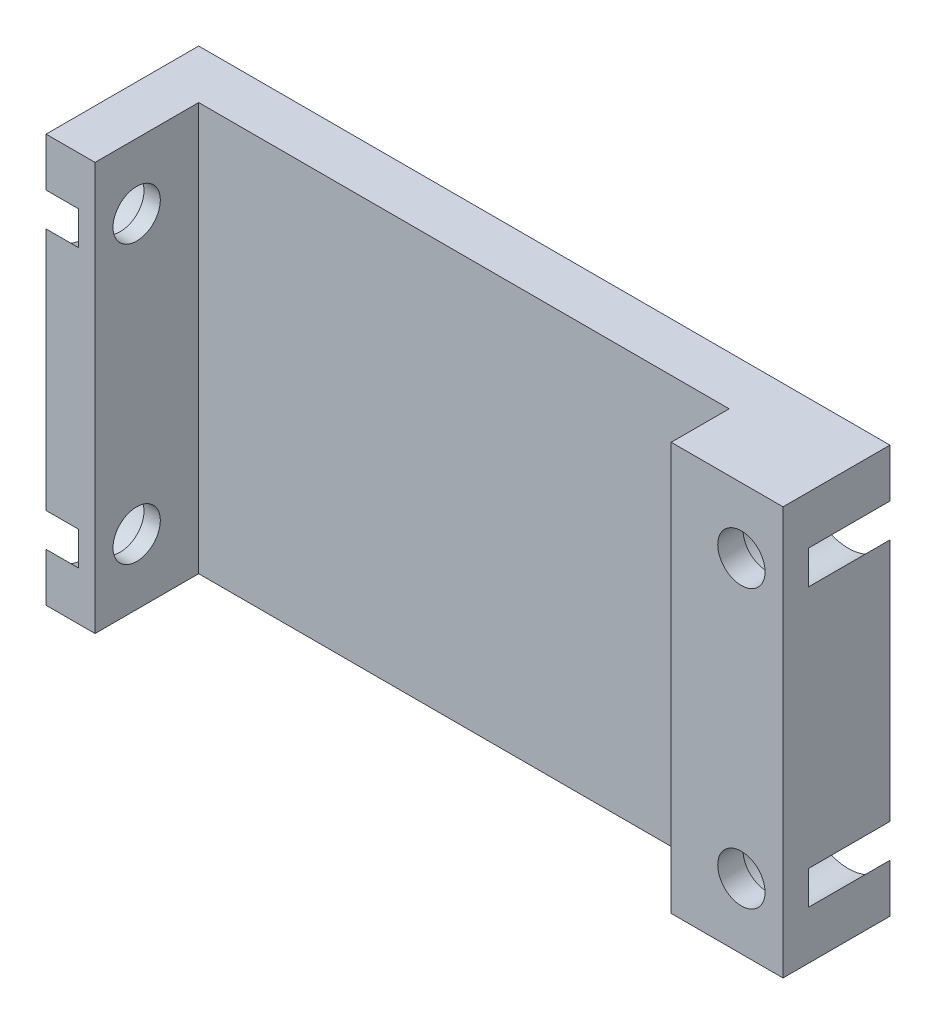
ISO-10303-21;
HEADER;
FILE_DESCRIPTION(('STEP AP214'),'2;1');
FILE_NAME('part.step','',(''),(''),'','','');
FILE_SCHEMA(('AUTOMOTIVE_DESIGN { 1 0 10303 214 1 1 1 1 }'));
ENDSEC;
DATA;
#1=APPLICATION_CONTEXT('core data for automotive mechanical design processes');
#2=APPLICATION_PROTOCOL_DEFINITION('international standard','automotive_design',2000,#1);
#3=PRODUCT_CONTEXT('',#1,'mechanical');
#4=PRODUCT('Part','Part','',(#3));
#5=PRODUCT_RELATED_PRODUCT_CATEGORY('part','',(#4));
#6=PRODUCT_DEFINITION_FORMATION('','',#4);
#7=PRODUCT_DEFINITION_CONTEXT('part definition',#1,'design');
#8=PRODUCT_DEFINITION('design','',#6,#7);
#9=PRODUCT_DEFINITION_SHAPE('','',#8);
#10=(LENGTH_UNIT() NAMED_UNIT(*) SI_UNIT(.MILLI.,.METRE.));
#11=(NAMED_UNIT(*) PLANE_ANGLE_UNIT() SI_UNIT($,.RADIAN.));
#12=(NAMED_UNIT(*) SI_UNIT($,.STERADIAN.) SOLID_ANGLE_UNIT());
#13=UNCERTAINTY_MEASURE_WITH_UNIT(LENGTH_MEASURE(1.E-05),#10,'distance_accuracy_value','');
#14=(GEOMETRIC_REPRESENTATION_CONTEXT(3) GLOBAL_UNCERTAINTY_ASSIGNED_CONTEXT((#13)) GLOBAL_UNIT_ASSIGNED_CONTEXT((#10,
#11,#12)) REPRESENTATION_CONTEXT('',''));
#15=CARTESIAN_POINT('',(0.,0.,0.));
#16=DIRECTION('',(0.,0.,1.));
#17=DIRECTION('',(1.,0.,0.));
#18=AXIS2_PLACEMENT_3D('',#15,#16,#17);
#19=CARTESIAN_POINT('',(-1.5,-22.5000000000001,-30.7214913134743));
#20=DIRECTION('',(-1.,0.,0.));
#21=DIRECTION('',(0.,0.,1.));
#22=AXIS2_PLACEMENT_3D('',#19,#20,#21);
#23=PLANE('',#22);
#24=DIRECTION('',(0.,1.,0.));
#25=VECTOR('',#24,1.);
#26=CARTESIAN_POINT('',(-1.5,-22.5000000000001,-3.79999999999977));
#27=LINE('',#26,#25);
#28=CARTESIAN_POINT('',(-1.5,-22.5000000000001,-3.79999999999977));
#29=VERTEX_POINT('',#28);
#30=CARTESIAN_POINT('',(-1.5,2.49999999999995,-3.79999999999978));
#31=VERTEX_POINT('',#30);
#32=EDGE_CURVE('E185',#29,#31,#27,.T.);
#33=ORIENTED_EDGE('',*,*,#32,.F.);
#34=DIRECTION('',(0.,0.,1.));
#35=VECTOR('',#34,1.);
#36=CARTESIAN_POINT('',(-1.5,-22.5000000000001,-30.7214913134743));
#37=LINE('',#36,#35);
#38=CARTESIAN_POINT('',(-1.5,-22.5000000000001,-0.25));
#39=VERTEX_POINT('',#38);
#40=EDGE_CURVE('E202',#29,#39,#37,.T.);
#41=ORIENTED_EDGE('',*,*,#40,.T.);
#42=DIRECTION('',(0.,-1.,0.));
#43=VECTOR('',#42,1.);
#44=CARTESIAN_POINT('',(-1.5,-22.5000000000001,-0.25));
#45=LINE('',#44,#43);
#46=CARTESIAN_POINT('',(-1.5,2.49999999999995,-0.25));
#47=VERTEX_POINT('',#46);
#48=EDGE_CURVE('E190',#47,#39,#45,.T.);
#49=ORIENTED_EDGE('',*,*,#48,.F.);
#50=DIRECTION('',(0.,0.,1.));
#51=VECTOR('',#50,1.);
#52=CARTESIAN_POINT('',(-1.5,2.49999999999995,-30.7214913134743));
#53=LINE('',#52,#51);
#54=EDGE_CURVE('E189',#31,#47,#53,.T.);
#55=ORIENTED_EDGE('',*,*,#54,.F.);
#56=EDGE_LOOP('',(#33,#41,#49,#55));
#57=FACE_BOUND('',#56,.T.);
#58=ADVANCED_FACE('F35',(#57),#23,.T.);
#59=CARTESIAN_POINT('',(-1.5,2.49999999999995,-30.7214913134743));
#60=DIRECTION('',(0.,1.,0.));
#61=DIRECTION('',(0.,0.,1.));
#62=AXIS2_PLACEMENT_3D('',#59,#60,#61);
#63=PLANE('',#62);
#64=DIRECTION('',(0.,0.,1.));
#65=VECTOR('',#64,1.);
#66=CARTESIAN_POINT('',(5.35008846034397,2.49999999999995,-30.7214913134743));
#67=LINE('',#66,#65);
#68=CARTESIAN_POINT('',(5.35008846034396,2.49999999999995,-6.79999999999978));
#69=VERTEX_POINT('',#68);
#70=CARTESIAN_POINT('',(5.35008846034397,2.49999999999995,-0.25));
#71=VERTEX_POINT('',#70);
#72=EDGE_CURVE('E204',#69,#71,#67,.T.);
#73=ORIENTED_EDGE('',*,*,#72,.F.);
#74=DIRECTION('',(1.,0.,0.));
#75=VECTOR('',#74,1.);
#76=CARTESIAN_POINT('',(5.35008846034396,2.49999999999995,-6.79999999999978));
#77=LINE('',#76,#75);
#78=CARTESIAN_POINT('',(-37.,2.49999999999995,-6.79999999999978));
#79=VERTEX_POINT('',#78);
#80=EDGE_CURVE('E165',#79,#69,#77,.T.);
#81=ORIENTED_EDGE('',*,*,#80,.F.);
#82=DIRECTION('',(0.,0.,-1.));
#83=VECTOR('',#82,1.);
#84=CARTESIAN_POINT('',(-37.,2.49999999999995,-6.79999999999978));
#85=LINE('',#84,#83);
#86=CARTESIAN_POINT('',(-37.,2.49999999999995,2.55));
#87=VERTEX_POINT('',#86);
#88=EDGE_CURVE('E277',#87,#79,#85,.T.);
#89=ORIENTED_EDGE('',*,*,#88,.F.);
#90=DIRECTION('',(1.,0.,0.));
#91=VECTOR('',#90,1.);
#92=CARTESIAN_POINT('',(-37.,2.49999999999995,2.55));
#93=LINE('',#92,#91);
#94=CARTESIAN_POINT('',(-34.,2.49999999999995,2.55));
#95=VERTEX_POINT('',#94);
#96=EDGE_CURVE('E281',#87,#95,#93,.T.);
#97=ORIENTED_EDGE('',*,*,#96,.T.);
#98=DIRECTION('',(0.,0.,-1.));
#99=VECTOR('',#98,1.);
#100=CARTESIAN_POINT('',(-34.,2.49999999999995,-6.79999999999978));
#101=LINE('',#100,#99);
#102=CARTESIAN_POINT('',(-34.,2.49999999999995,-3.79999999999978));
#103=VERTEX_POINT('',#102);
#104=EDGE_CURVE('E271',#95,#103,#101,.T.);
#105=ORIENTED_EDGE('',*,*,#104,.T.);
#106=DIRECTION('',(1.,0.,0.));
#107=VECTOR('',#106,1.);
#108=CARTESIAN_POINT('',(5.35008846034396,2.49999999999995,-3.79999999999978));
#109=LINE('',#108,#107);
#110=EDGE_CURVE('E172',#103,#31,#109,.T.);
#111=ORIENTED_EDGE('',*,*,#110,.T.);
#112=ORIENTED_EDGE('',*,*,#54,.T.);
#113=DIRECTION('',(-1.,0.,0.));
#114=VECTOR('',#113,1.);
#115=CARTESIAN_POINT('',(-1.5,2.49999999999995,-0.25));
#116=LINE('',#115,#114);
#117=EDGE_CURVE('E199',#71,#47,#116,.T.);
#118=ORIENTED_EDGE('',*,*,#117,.F.);
#119=EDGE_LOOP('',(#73,#81,#89,#97,#105,#111,#112,#118));
#120=FACE_BOUND('',#119,.T.);
#121=ADVANCED_FACE('F310',(#120),#63,.T.);
#122=CARTESIAN_POINT('',(5.35008846034397,-22.5000000000001,-30.7214913134743));
#123=DIRECTION('',(1.,0.,0.));
#124=DIRECTION('',(0.,0.,-1.));
#125=AXIS2_PLACEMENT_3D('',#122,#123,#124);
#126=PLANE('',#125);
#127=DIRECTION('',(0.,0.,-1.));
#128=VECTOR('',#127,1.);
#129=CARTESIAN_POINT('',(5.35008846034396,-2.52934389026236,-6.79999999999978));
#130=LINE('',#129,#128);
#131=CARTESIAN_POINT('',(5.35008846034397,-2.52934389026236,-1.79999999999977));
#132=VERTEX_POINT('',#131);
#133=CARTESIAN_POINT('',(5.35008846034396,-2.52934389026236,-6.79999999999978));
#134=VERTEX_POINT('',#133);
#135=EDGE_CURVE('E49',#132,#134,#130,.T.);
#136=ORIENTED_EDGE('',*,*,#135,.F.);
#137=DIRECTION('',(0.,-1.,0.));
#138=VECTOR('',#137,1.);
#139=CARTESIAN_POINT('',(5.35008846034397,-22.5000000000001,-1.79999999999977));
#140=LINE('',#139,#138);
#141=CARTESIAN_POINT('',(5.35008846034397,-0.470656109737746,-1.79999999999977));
#142=VERTEX_POINT('',#141);
#143=EDGE_CURVE('E11',#142,#132,#140,.T.);
#144=ORIENTED_EDGE('',*,*,#143,.F.);
#145=DIRECTION('',(0.,0.,-1.));
#146=VECTOR('',#145,1.);
#147=CARTESIAN_POINT('',(5.35008846034396,-0.470656109737747,-6.79999999999978));
#148=LINE('',#147,#146);
#149=CARTESIAN_POINT('',(5.35008846034396,-0.470656109737745,-6.79999999999978));
#150=VERTEX_POINT('',#149);
#151=EDGE_CURVE('E148',#150,#142,#148,.F.);
#152=ORIENTED_EDGE('',*,*,#151,.F.);
#153=DIRECTION('',(0.,-1.,0.));
#154=VECTOR('',#153,1.);
#155=CARTESIAN_POINT('',(5.35008846034396,2.49999999999995,-6.79999999999978));
#156=LINE('',#155,#154);
#157=EDGE_CURVE('E159',#69,#150,#156,.T.);
#158=ORIENTED_EDGE('',*,*,#157,.F.);
#159=ORIENTED_EDGE('',*,*,#72,.T.);
#160=DIRECTION('',(0.,1.,0.));
#161=VECTOR('',#160,1.);
#162=CARTESIAN_POINT('',(5.35008846034397,-22.5000000000001,-0.25));
#163=LINE('',#162,#161);
#164=CARTESIAN_POINT('',(5.35008846034397,-22.5000000000001,-0.25));
#165=VERTEX_POINT('',#164);
#166=EDGE_CURVE('E196',#165,#71,#163,.T.);
#167=ORIENTED_EDGE('',*,*,#166,.F.);
#168=DIRECTION('',(0.,0.,1.));
#169=VECTOR('',#168,1.);
#170=CARTESIAN_POINT('',(5.35008846034397,-22.5000000000001,-30.7214913134743));
#171=LINE('',#170,#169);
#172=CARTESIAN_POINT('',(5.35008846034396,-22.5000000000001,-6.79999999999978));
#173=VERTEX_POINT('',#172);
#174=EDGE_CURVE('E206',#173,#165,#171,.T.);
#175=ORIENTED_EDGE('',*,*,#174,.F.);
#176=CARTESIAN_POINT('',(5.35008846034396,-19.5293438902624,-6.79999999999978));
#177=VERTEX_POINT('',#176);
#178=EDGE_CURVE('E169',#177,#173,#156,.T.);
#179=ORIENTED_EDGE('',*,*,#178,.F.);
#180=DIRECTION('',(0.,0.,-1.));
#181=VECTOR('',#180,1.);
#182=CARTESIAN_POINT('',(5.35008846034396,-19.5293438902624,-6.79999999999978));
#183=LINE('',#182,#181);
#184=CARTESIAN_POINT('',(5.35008846034397,-19.5293438902624,-1.79999999999977));
#185=VERTEX_POINT('',#184);
#186=EDGE_CURVE('E57',#185,#177,#183,.T.);
#187=ORIENTED_EDGE('',*,*,#186,.F.);
#188=DIRECTION('',(0.,-1.,0.));
#189=VECTOR('',#188,1.);
#190=CARTESIAN_POINT('',(5.35008846034397,-22.5000000000001,-1.79999999999977));
#191=LINE('',#190,#189);
#192=CARTESIAN_POINT('',(5.35008846034397,-17.4706561097377,-1.79999999999977));
#193=VERTEX_POINT('',#192);
#194=EDGE_CURVE('E153',#193,#185,#191,.T.);
#195=ORIENTED_EDGE('',*,*,#194,.F.);
#196=DIRECTION('',(0.,0.,-1.));
#197=VECTOR('',#196,1.);
#198=CARTESIAN_POINT('',(5.35008846034396,-17.4706561097377,-6.79999999999978));
#199=LINE('',#198,#197);
#200=CARTESIAN_POINT('',(5.35008846034396,-17.4706561097377,-6.79999999999978));
#201=VERTEX_POINT('',#200);
#202=EDGE_CURVE('E235',#201,#193,#199,.F.);
#203=ORIENTED_EDGE('',*,*,#202,.F.);
#204=EDGE_CURVE('E167',#134,#201,#156,.T.);
#205=ORIENTED_EDGE('',*,*,#204,.F.);
#206=EDGE_LOOP('',(#136,#144,#152,#158,#159,#167,#175,#179,#187,#195,#203,#205));
#207=FACE_BOUND('',#206,.T.);
#208=ADVANCED_FACE('F158',(#207),#126,.T.);
#209=CARTESIAN_POINT('',(-1.5,-22.5000000000001,-30.7214913134743));
#210=DIRECTION('',(0.,-1.,0.));
#211=DIRECTION('',(0.,0.,-1.));
#212=AXIS2_PLACEMENT_3D('',#209,#210,#211);
#213=PLANE('',#212);
#214=ORIENTED_EDGE('',*,*,#40,.F.);
#215=DIRECTION('',(-1.,0.,0.));
#216=VECTOR('',#215,1.);
#217=CARTESIAN_POINT('',(5.35008846034396,-22.5000000000001,-3.79999999999978));
#218=LINE('',#217,#216);
#219=CARTESIAN_POINT('',(-34.,-22.5000000000001,-3.79999999999978));
#220=VERTEX_POINT('',#219);
#221=EDGE_CURVE('E181',#29,#220,#218,.T.);
#222=ORIENTED_EDGE('',*,*,#221,.T.);
#223=DIRECTION('',(0.,0.,1.));
#224=VECTOR('',#223,1.);
#225=CARTESIAN_POINT('',(-34.,-22.5000000000001,-6.79999999999978));
#226=LINE('',#225,#224);
#227=CARTESIAN_POINT('',(-34.,-22.5000000000001,2.55));
#228=VERTEX_POINT('',#227);
#229=EDGE_CURVE('E263',#220,#228,#226,.T.);
#230=ORIENTED_EDGE('',*,*,#229,.T.);
#231=DIRECTION('',(1.,0.,0.));
#232=VECTOR('',#231,1.);
#233=CARTESIAN_POINT('',(-37.,-22.5000000000001,2.55));
#234=LINE('',#233,#232);
#235=CARTESIAN_POINT('',(-37.,-22.5000000000001,2.55));
#236=VERTEX_POINT('',#235);
#237=EDGE_CURVE('E287',#236,#228,#234,.T.);
#238=ORIENTED_EDGE('',*,*,#237,.F.);
#239=DIRECTION('',(0.,0.,1.));
#240=VECTOR('',#239,1.);
#241=CARTESIAN_POINT('',(-37.,-22.5000000000001,-6.79999999999978));
#242=LINE('',#241,#240);
#243=CARTESIAN_POINT('',(-37.,-22.5000000000001,-6.79999999999978));
#244=VERTEX_POINT('',#243);
#245=EDGE_CURVE('E270',#244,#236,#242,.T.);
#246=ORIENTED_EDGE('',*,*,#245,.F.);
#247=DIRECTION('',(-1.,0.,0.));
#248=VECTOR('',#247,1.);
#249=CARTESIAN_POINT('',(5.35008846034396,-22.5000000000001,-6.79999999999978));
#250=LINE('',#249,#248);
#251=EDGE_CURVE('E166',#173,#244,#250,.T.);
#252=ORIENTED_EDGE('',*,*,#251,.F.);
#253=ORIENTED_EDGE('',*,*,#174,.T.);
#254=DIRECTION('',(1.,0.,0.));
#255=VECTOR('',#254,1.);
#256=CARTESIAN_POINT('',(-1.5,-22.5000000000001,-0.25));
#257=LINE('',#256,#255);
#258=EDGE_CURVE('E193',#39,#165,#257,.T.);
#259=ORIENTED_EDGE('',*,*,#258,.F.);
#260=EDGE_LOOP('',(#214,#222,#230,#238,#246,#252,#253,#259));
#261=FACE_BOUND('',#260,.T.);
#262=ADVANCED_FACE('F298',(#261),#213,.T.);
#263=CARTESIAN_POINT('',(0.,0.,-0.25));
#264=DIRECTION('',(0.,0.,-1.));
#265=DIRECTION('',(-1.,0.,0.));
#266=AXIS2_PLACEMENT_3D('',#263,#264,#265);
#267=PLANE('',#266);
#268=CARTESIAN_POINT('',(2.79999999999996,-1.50000000000005,-0.25));
#269=DIRECTION('',(0.,0.,-1.));
#270=DIRECTION('',(-1.,0.,0.));
#271=AXIS2_PLACEMENT_3D('',#268,#269,#270);
#272=CIRCLE('',#271,1.45);
#273=CARTESIAN_POINT('',(1.34999999999996,-1.50000000000005,-0.25));
#274=VERTEX_POINT('',#273);
#275=EDGE_CURVE('E160',#274,#274,#272,.T.);
#276=ORIENTED_EDGE('',*,*,#275,.T.);
#277=EDGE_LOOP('',(#276));
#278=FACE_BOUND('',#277,.T.);
#279=CARTESIAN_POINT('',(2.79999999999996,-18.5000000000001,-0.25));
#280=DIRECTION('',(0.,0.,-1.));
#281=DIRECTION('',(-1.,0.,0.));
#282=AXIS2_PLACEMENT_3D('',#279,#280,#281);
#283=CIRCLE('',#282,1.45);
#284=CARTESIAN_POINT('',(1.34999999999996,-18.5000000000001,-0.25));
#285=VERTEX_POINT('',#284);
#286=EDGE_CURVE('E232',#285,#285,#283,.T.);
#287=ORIENTED_EDGE('',*,*,#286,.T.);
#288=EDGE_LOOP('',(#287));
#289=FACE_BOUND('',#288,.T.);
#290=ORIENTED_EDGE('',*,*,#48,.T.);
#291=ORIENTED_EDGE('',*,*,#258,.T.);
#292=ORIENTED_EDGE('',*,*,#166,.T.);
#293=ORIENTED_EDGE('',*,*,#117,.T.);
#294=EDGE_LOOP('',(#290,#291,#292,#293));
#295=FACE_BOUND('',#294,.T.);
#296=ADVANCED_FACE('F352',(#278,#289,#295),#267,.F.);
#297=CARTESIAN_POINT('',(0.,0.,-3.79999999999978));
#298=DIRECTION('',(0.,0.,-1.));
#299=DIRECTION('',(-1.,0.,0.));
#300=AXIS2_PLACEMENT_3D('',#297,#298,#299);
#301=PLANE('',#300);
#302=ORIENTED_EDGE('',*,*,#221,.F.);
#303=ORIENTED_EDGE('',*,*,#32,.T.);
#304=ORIENTED_EDGE('',*,*,#110,.F.);
#305=DIRECTION('',(0.,1.,0.));
#306=VECTOR('',#305,1.);
#307=CARTESIAN_POINT('',(-34.,2.49999999999995,-3.79999999999978));
#308=LINE('',#307,#306);
#309=EDGE_CURVE('E176',#220,#103,#308,.T.);
#310=ORIENTED_EDGE('',*,*,#309,.F.);
#311=EDGE_LOOP('',(#302,#303,#304,#310));
#312=FACE_BOUND('',#311,.T.);
#313=ADVANCED_FACE('F302',(#312),#301,.F.);
#314=CARTESIAN_POINT('',(0.,0.,-6.79999999999978));
#315=DIRECTION('',(0.,0.,-1.));
#316=DIRECTION('',(-1.,0.,0.));
#317=AXIS2_PLACEMENT_3D('',#314,#315,#316);
#318=PLANE('',#317);
#319=CARTESIAN_POINT('',(2.79999999999996,-1.50000000000005,-6.79999999999978));
#320=DIRECTION('',(0.,0.,-1.));
#321=DIRECTION('',(-1.,0.,0.));
#322=AXIS2_PLACEMENT_3D('',#319,#320,#321);
#323=CIRCLE('',#322,2.75);
#324=EDGE_CURVE('E42',#134,#150,#323,.T.);
#325=ORIENTED_EDGE('',*,*,#324,.F.);
#326=ORIENTED_EDGE('',*,*,#204,.T.);
#327=CARTESIAN_POINT('',(2.79999999999996,-18.5000000000001,-6.79999999999978));
#328=DIRECTION('',(0.,0.,-1.));
#329=DIRECTION('',(-1.,0.,0.));
#330=AXIS2_PLACEMENT_3D('',#327,#328,#329);
#331=CIRCLE('',#330,2.75);
#332=EDGE_CURVE('E219',#177,#201,#331,.T.);
#333=ORIENTED_EDGE('',*,*,#332,.F.);
#334=ORIENTED_EDGE('',*,*,#178,.T.);
#335=ORIENTED_EDGE('',*,*,#251,.T.);
#336=DIRECTION('',(0.,-1.,0.));
#337=VECTOR('',#336,1.);
#338=CARTESIAN_POINT('',(-37.,-22.5000000000001,-6.79999999999978));
#339=LINE('',#338,#337);
#340=EDGE_CURVE('E267',#79,#244,#339,.T.);
#341=ORIENTED_EDGE('',*,*,#340,.F.);
#342=ORIENTED_EDGE('',*,*,#80,.T.);
#343=ORIENTED_EDGE('',*,*,#157,.T.);
#344=EDGE_LOOP('',(#325,#326,#333,#334,#335,#341,#342,#343));
#345=FACE_BOUND('',#344,.T.);
#346=ADVANCED_FACE('F163',(#345),#318,.T.);
#347=CARTESIAN_POINT('',(-37.,-22.5000000000001,2.55));
#348=DIRECTION('',(0.,0.,-1.));
#349=DIRECTION('',(-1.,0.,0.));
#350=AXIS2_PLACEMENT_3D('',#347,#348,#349);
#351=PLANE('',#350);
#352=DIRECTION('',(0.,-1.,0.));
#353=VECTOR('',#352,1.);
#354=CARTESIAN_POINT('',(-35.,-22.5000000000001,2.55));
#355=LINE('',#354,#353);
#356=CARTESIAN_POINT('',(-35.,-0.470436985901365,2.55));
#357=VERTEX_POINT('',#356);
#358=CARTESIAN_POINT('',(-35.,-2.52956301409878,2.55));
#359=VERTEX_POINT('',#358);
#360=EDGE_CURVE('E217',#357,#359,#355,.T.);
#361=ORIENTED_EDGE('',*,*,#360,.T.);
#362=DIRECTION('',(-1.,0.,0.));
#363=VECTOR('',#362,1.);
#364=CARTESIAN_POINT('',(-37.0000000000001,-2.52956301409878,2.55));
#365=LINE('',#364,#363);
#366=CARTESIAN_POINT('',(-37.0000000000001,-2.52956301409878,2.55));
#367=VERTEX_POINT('',#366);
#368=EDGE_CURVE('E252',#359,#367,#365,.T.);
#369=ORIENTED_EDGE('',*,*,#368,.T.);
#370=DIRECTION('',(0.,1.,0.));
#371=VECTOR('',#370,1.);
#372=CARTESIAN_POINT('',(-37.,-22.5000000000001,2.55));
#373=LINE('',#372,#371);
#374=CARTESIAN_POINT('',(-37.,-17.4704369859014,2.55));
#375=VERTEX_POINT('',#374);
#376=EDGE_CURVE('E278',#375,#367,#373,.T.);
#377=ORIENTED_EDGE('',*,*,#376,.F.);
#378=DIRECTION('',(-1.,0.,0.));
#379=VECTOR('',#378,1.);
#380=CARTESIAN_POINT('',(-37.,-17.4704369859014,2.55));
#381=LINE('',#380,#379);
#382=CARTESIAN_POINT('',(-35.,-17.4704369859014,2.55));
#383=VERTEX_POINT('',#382);
#384=EDGE_CURVE('E188',#375,#383,#381,.F.);
#385=ORIENTED_EDGE('',*,*,#384,.T.);
#386=DIRECTION('',(0.,-1.,0.));
#387=VECTOR('',#386,1.);
#388=CARTESIAN_POINT('',(-35.,-22.5000000000001,2.55));
#389=LINE('',#388,#387);
#390=CARTESIAN_POINT('',(-35.,-19.5295630140988,2.55));
#391=VERTEX_POINT('',#390);
#392=EDGE_CURVE('E211',#383,#391,#389,.T.);
#393=ORIENTED_EDGE('',*,*,#392,.T.);
#394=DIRECTION('',(-1.,0.,0.));
#395=VECTOR('',#394,1.);
#396=CARTESIAN_POINT('',(-37.,-19.5295630140988,2.55));
#397=LINE('',#396,#395);
#398=CARTESIAN_POINT('',(-37.,-19.5295630140988,2.55));
#399=VERTEX_POINT('',#398);
#400=EDGE_CURVE('E214',#391,#399,#397,.T.);
#401=ORIENTED_EDGE('',*,*,#400,.T.);
#402=EDGE_CURVE('E274',#236,#399,#373,.T.);
#403=ORIENTED_EDGE('',*,*,#402,.F.);
#404=ORIENTED_EDGE('',*,*,#237,.T.);
#405=DIRECTION('',(0.,1.,0.));
#406=VECTOR('',#405,1.);
#407=CARTESIAN_POINT('',(-34.,-22.5000000000001,2.55));
#408=LINE('',#407,#406);
#409=EDGE_CURVE('E283',#228,#95,#408,.T.);
#410=ORIENTED_EDGE('',*,*,#409,.T.);
#411=ORIENTED_EDGE('',*,*,#96,.F.);
#412=CARTESIAN_POINT('',(-37.,-0.470436985901365,2.55));
#413=VERTEX_POINT('',#412);
#414=EDGE_CURVE('E273',#413,#87,#373,.T.);
#415=ORIENTED_EDGE('',*,*,#414,.F.);
#416=DIRECTION('',(-1.,0.,0.));
#417=VECTOR('',#416,1.);
#418=CARTESIAN_POINT('',(-37.0000000000001,-0.470436985901365,2.55));
#419=LINE('',#418,#417);
#420=EDGE_CURVE('E246',#413,#357,#419,.F.);
#421=ORIENTED_EDGE('',*,*,#420,.T.);
#422=EDGE_LOOP('',(#361,#369,#377,#385,#393,#401,#403,#404,#410,#411,#415,#421));
#423=FACE_BOUND('',#422,.T.);
#424=ADVANCED_FACE('F307',(#423),#351,.F.);
#425=CARTESIAN_POINT('',(-37.,0.,0.));
#426=DIRECTION('',(1.,0.,0.));
#427=DIRECTION('',(0.,0.,-1.));
#428=AXIS2_PLACEMENT_3D('',#425,#426,#427);
#429=PLANE('',#428);
#430=ORIENTED_EDGE('',*,*,#376,.T.);
#431=CARTESIAN_POINT('',(-37.0000000000001,-1.50000000000007,0.));
#432=DIRECTION('',(-1.,0.,0.));
#433=DIRECTION('',(0.,0.,1.));
#434=AXIS2_PLACEMENT_3D('',#431,#432,#433);
#435=CIRCLE('',#434,2.75);
#436=EDGE_CURVE('E238',#413,#367,#435,.T.);
#437=ORIENTED_EDGE('',*,*,#436,.F.);
#438=ORIENTED_EDGE('',*,*,#414,.T.);
#439=ORIENTED_EDGE('',*,*,#88,.T.);
#440=ORIENTED_EDGE('',*,*,#340,.T.);
#441=ORIENTED_EDGE('',*,*,#245,.T.);
#442=ORIENTED_EDGE('',*,*,#402,.T.);
#443=CARTESIAN_POINT('',(-37.,-18.5000000000001,0.));
#444=DIRECTION('',(-1.,0.,0.));
#445=DIRECTION('',(0.,0.,1.));
#446=AXIS2_PLACEMENT_3D('',#443,#444,#445);
#447=CIRCLE('',#446,2.75);
#448=EDGE_CURVE('E255',#375,#399,#447,.T.);
#449=ORIENTED_EDGE('',*,*,#448,.F.);
#450=EDGE_LOOP('',(#430,#437,#438,#439,#440,#441,#442,#449));
#451=FACE_BOUND('',#450,.T.);
#452=ADVANCED_FACE('F313',(#451),#429,.F.);
#453=CARTESIAN_POINT('',(-34.,0.,0.));
#454=DIRECTION('',(1.,0.,0.));
#455=DIRECTION('',(0.,0.,-1.));
#456=AXIS2_PLACEMENT_3D('',#453,#454,#455);
#457=PLANE('',#456);
#458=CARTESIAN_POINT('',(-34.,-1.50000000000007,0.));
#459=DIRECTION('',(1.,0.,0.));
#460=DIRECTION('',(0.,0.,-1.));
#461=AXIS2_PLACEMENT_3D('',#458,#459,#460);
#462=CIRCLE('',#461,1.45);
#463=CARTESIAN_POINT('',(-34.,-1.50000000000007,-1.45));
#464=VERTEX_POINT('',#463);
#465=EDGE_CURVE('E243',#464,#464,#462,.F.);
#466=ORIENTED_EDGE('',*,*,#465,.T.);
#467=EDGE_LOOP('',(#466));
#468=FACE_BOUND('',#467,.T.);
#469=CARTESIAN_POINT('',(-34.,-18.5000000000001,0.));
#470=DIRECTION('',(1.,0.,0.));
#471=DIRECTION('',(0.,0.,-1.));
#472=AXIS2_PLACEMENT_3D('',#469,#470,#471);
#473=CIRCLE('',#472,1.45);
#474=CARTESIAN_POINT('',(-34.,-18.5000000000001,-1.45));
#475=VERTEX_POINT('',#474);
#476=EDGE_CURVE('E260',#475,#475,#473,.F.);
#477=ORIENTED_EDGE('',*,*,#476,.T.);
#478=EDGE_LOOP('',(#477));
#479=FACE_BOUND('',#478,.T.);
#480=ORIENTED_EDGE('',*,*,#229,.F.);
#481=ORIENTED_EDGE('',*,*,#309,.T.);
#482=ORIENTED_EDGE('',*,*,#104,.F.);
#483=ORIENTED_EDGE('',*,*,#409,.F.);
#484=EDGE_LOOP('',(#480,#481,#482,#483));
#485=FACE_BOUND('',#484,.T.);
#486=ADVANCED_FACE('F305',(#468,#479,#485),#457,.T.);
#487=CARTESIAN_POINT('',(-35.,-17.0500000000001,0.));
#488=DIRECTION('',(1.,0.,0.));
#489=DIRECTION('',(0.,0.,-1.));
#490=AXIS2_PLACEMENT_3D('',#487,#488,#489);
#491=PLANE('',#490);
#492=CARTESIAN_POINT('',(-35.,-18.5000000000001,0.));
#493=DIRECTION('',(-1.,0.,0.));
#494=DIRECTION('',(0.,0.,1.));
#495=AXIS2_PLACEMENT_3D('',#492,#493,#494);
#496=CIRCLE('',#495,1.45);
#497=CARTESIAN_POINT('',(-35.,-18.5000000000001,1.45));
#498=VERTEX_POINT('',#497);
#499=EDGE_CURVE('E256',#498,#498,#496,.T.);
#500=ORIENTED_EDGE('',*,*,#499,.F.);
#501=EDGE_LOOP('',(#500));
#502=FACE_BOUND('',#501,.T.);
#503=CARTESIAN_POINT('',(-35.,-18.5000000000001,0.));
#504=DIRECTION('',(-1.,0.,0.));
#505=DIRECTION('',(0.,0.,1.));
#506=AXIS2_PLACEMENT_3D('',#503,#504,#505);
#507=CIRCLE('',#506,2.75);
#508=EDGE_CURVE('E259',#383,#391,#507,.T.);
#509=ORIENTED_EDGE('',*,*,#508,.T.);
#510=ORIENTED_EDGE('',*,*,#392,.F.);
#511=EDGE_LOOP('',(#509,#510));
#512=FACE_BOUND('',#511,.T.);
#513=ADVANCED_FACE('F323',(#502,#512),#491,.F.);
#514=CARTESIAN_POINT('',(-37.,-18.5000000000001,0.));
#515=DIRECTION('',(-1.,0.,0.));
#516=DIRECTION('',(0.,0.,1.));
#517=AXIS2_PLACEMENT_3D('',#514,#515,#516);
#518=CYLINDRICAL_SURFACE('',#517,2.75);
#519=ORIENTED_EDGE('',*,*,#508,.F.);
#520=ORIENTED_EDGE('',*,*,#384,.F.);
#521=ORIENTED_EDGE('',*,*,#448,.T.);
#522=ORIENTED_EDGE('',*,*,#400,.F.);
#523=EDGE_LOOP('',(#519,#520,#521,#522));
#524=FACE_BOUND('',#523,.T.);
#525=ADVANCED_FACE('F321',(#524),#518,.F.);
#526=CARTESIAN_POINT('',(-37.,-18.5000000000001,0.));
#527=DIRECTION('',(-1.,0.,0.));
#528=DIRECTION('',(0.,0.,1.));
#529=AXIS2_PLACEMENT_3D('',#526,#527,#528);
#530=CYLINDRICAL_SURFACE('',#529,1.45);
#531=ORIENTED_EDGE('',*,*,#476,.F.);
#532=EDGE_LOOP('',(#531));
#533=FACE_BOUND('',#532,.T.);
#534=ORIENTED_EDGE('',*,*,#499,.T.);
#535=EDGE_LOOP('',(#534));
#536=FACE_BOUND('',#535,.T.);
#537=ADVANCED_FACE('F330',(#533,#536),#530,.F.);
#538=CARTESIAN_POINT('',(-35.,-0.0500000000000715,0.));
#539=DIRECTION('',(1.,0.,0.));
#540=DIRECTION('',(0.,0.,-1.));
#541=AXIS2_PLACEMENT_3D('',#538,#539,#540);
#542=PLANE('',#541);
#543=CARTESIAN_POINT('',(-35.,-1.50000000000007,0.));
#544=DIRECTION('',(-1.,0.,0.));
#545=DIRECTION('',(0.,0.,1.));
#546=AXIS2_PLACEMENT_3D('',#543,#544,#545);
#547=CIRCLE('',#546,1.45);
#548=CARTESIAN_POINT('',(-35.,-1.50000000000007,1.45));
#549=VERTEX_POINT('',#548);
#550=EDGE_CURVE('E239',#549,#549,#547,.T.);
#551=ORIENTED_EDGE('',*,*,#550,.F.);
#552=EDGE_LOOP('',(#551));
#553=FACE_BOUND('',#552,.T.);
#554=CARTESIAN_POINT('',(-35.,-1.50000000000007,0.));
#555=DIRECTION('',(-1.,0.,0.));
#556=DIRECTION('',(0.,0.,1.));
#557=AXIS2_PLACEMENT_3D('',#554,#555,#556);
#558=CIRCLE('',#557,2.75);
#559=EDGE_CURVE('E242',#357,#359,#558,.T.);
#560=ORIENTED_EDGE('',*,*,#559,.T.);
#561=ORIENTED_EDGE('',*,*,#360,.F.);
#562=EDGE_LOOP('',(#560,#561));
#563=FACE_BOUND('',#562,.T.);
#564=ADVANCED_FACE('F328',(#553,#563),#542,.F.);
#565=CARTESIAN_POINT('',(-37.0000000000001,-1.50000000000007,0.));
#566=DIRECTION('',(-1.,0.,0.));
#567=DIRECTION('',(0.,0.,1.));
#568=AXIS2_PLACEMENT_3D('',#565,#566,#567);
#569=CYLINDRICAL_SURFACE('',#568,2.75);
#570=ORIENTED_EDGE('',*,*,#559,.F.);
#571=ORIENTED_EDGE('',*,*,#420,.F.);
#572=ORIENTED_EDGE('',*,*,#436,.T.);
#573=ORIENTED_EDGE('',*,*,#368,.F.);
#574=EDGE_LOOP('',(#570,#571,#572,#573));
#575=FACE_BOUND('',#574,.T.);
#576=ADVANCED_FACE('F326',(#575),#569,.F.);
#577=CARTESIAN_POINT('',(-37.0000000000001,-1.50000000000007,0.));
#578=DIRECTION('',(-1.,0.,0.));
#579=DIRECTION('',(0.,0.,1.));
#580=AXIS2_PLACEMENT_3D('',#577,#578,#579);
#581=CYLINDRICAL_SURFACE('',#580,1.45);
#582=ORIENTED_EDGE('',*,*,#465,.F.);
#583=EDGE_LOOP('',(#582));
#584=FACE_BOUND('',#583,.T.);
#585=ORIENTED_EDGE('',*,*,#550,.T.);
#586=EDGE_LOOP('',(#585));
#587=FACE_BOUND('',#586,.T.);
#588=ADVANCED_FACE('F337',(#584,#587),#581,.F.);
#589=CARTESIAN_POINT('',(2.79999999999996,-18.5000000000001,-6.79999999999978));
#590=DIRECTION('',(0.,0.,-1.));
#591=DIRECTION('',(-1.,0.,0.));
#592=AXIS2_PLACEMENT_3D('',#589,#590,#591);
#593=CYLINDRICAL_SURFACE('',#592,1.45);
#594=ORIENTED_EDGE('',*,*,#286,.F.);
#595=EDGE_LOOP('',(#594));
#596=FACE_BOUND('',#595,.T.);
#597=CARTESIAN_POINT('',(2.79999999999996,-18.5000000000001,-1.79999999999977));
#598=DIRECTION('',(0.,0.,-1.));
#599=DIRECTION('',(-1.,0.,0.));
#600=AXIS2_PLACEMENT_3D('',#597,#598,#599);
#601=CIRCLE('',#600,1.45);
#602=CARTESIAN_POINT('',(1.34999999999996,-18.5000000000001,-1.79999999999977));
#603=VERTEX_POINT('',#602);
#604=EDGE_CURVE('E229',#603,#603,#601,.T.);
#605=ORIENTED_EDGE('',*,*,#604,.T.);
#606=EDGE_LOOP('',(#605));
#607=FACE_BOUND('',#606,.T.);
#608=ADVANCED_FACE('F358',(#596,#607),#593,.F.);
#609=CARTESIAN_POINT('',(4.24999999999996,-18.5000000000001,-1.79999999999977));
#610=DIRECTION('',(0.,0.,1.));
#611=DIRECTION('',(1.,0.,0.));
#612=AXIS2_PLACEMENT_3D('',#609,#610,#611);
#613=PLANE('',#612);
#614=ORIENTED_EDGE('',*,*,#194,.T.);
#615=CARTESIAN_POINT('',(2.79999999999996,-18.5000000000001,-1.79999999999977));
#616=DIRECTION('',(0.,0.,-1.));
#617=DIRECTION('',(-1.,0.,0.));
#618=AXIS2_PLACEMENT_3D('',#615,#616,#617);
#619=CIRCLE('',#618,2.75);
#620=EDGE_CURVE('E227',#185,#193,#619,.T.);
#621=ORIENTED_EDGE('',*,*,#620,.T.);
#622=EDGE_LOOP('',(#614,#621));
#623=FACE_BOUND('',#622,.T.);
#624=ORIENTED_EDGE('',*,*,#604,.F.);
#625=EDGE_LOOP('',(#624));
#626=FACE_BOUND('',#625,.T.);
#627=ADVANCED_FACE('F355',(#623,#626),#613,.F.);
#628=CARTESIAN_POINT('',(2.79999999999996,-18.5000000000001,-6.79999999999978));
#629=DIRECTION('',(0.,0.,-1.));
#630=DIRECTION('',(-1.,0.,0.));
#631=AXIS2_PLACEMENT_3D('',#628,#629,#630);
#632=CYLINDRICAL_SURFACE('',#631,2.75);
#633=ORIENTED_EDGE('',*,*,#186,.T.);
#634=ORIENTED_EDGE('',*,*,#332,.T.);
#635=ORIENTED_EDGE('',*,*,#202,.T.);
#636=ORIENTED_EDGE('',*,*,#620,.F.);
#637=EDGE_LOOP('',(#633,#634,#635,#636));
#638=FACE_BOUND('',#637,.T.);
#639=ADVANCED_FACE('F354',(#638),#632,.F.);
#640=CARTESIAN_POINT('',(2.79999999999996,-1.50000000000005,-6.79999999999978));
#641=DIRECTION('',(0.,0.,-1.));
#642=DIRECTION('',(-1.,0.,0.));
#643=AXIS2_PLACEMENT_3D('',#640,#641,#642);
#644=CYLINDRICAL_SURFACE('',#643,1.45);
#645=ORIENTED_EDGE('',*,*,#275,.F.);
#646=EDGE_LOOP('',(#645));
#647=FACE_BOUND('',#646,.T.);
#648=CARTESIAN_POINT('',(2.79999999999996,-1.50000000000005,-1.79999999999977));
#649=DIRECTION('',(0.,0.,-1.));
#650=DIRECTION('',(-1.,0.,0.));
#651=AXIS2_PLACEMENT_3D('',#648,#649,#650);
#652=CIRCLE('',#651,1.45);
#653=CARTESIAN_POINT('',(1.34999999999996,-1.50000000000005,-1.79999999999977));
#654=VERTEX_POINT('',#653);
#655=EDGE_CURVE('E549',#654,#654,#652,.T.);
#656=ORIENTED_EDGE('',*,*,#655,.T.);
#657=EDGE_LOOP('',(#656));
#658=FACE_BOUND('',#657,.T.);
#659=ADVANCED_FACE('F373',(#647,#658),#644,.F.);
#660=CARTESIAN_POINT('',(4.24999999999996,-1.50000000000005,-1.79999999999977));
#661=DIRECTION('',(0.,0.,1.));
#662=DIRECTION('',(1.,0.,0.));
#663=AXIS2_PLACEMENT_3D('',#660,#661,#662);
#664=PLANE('',#663);
#665=ORIENTED_EDGE('',*,*,#143,.T.);
#666=CARTESIAN_POINT('',(2.79999999999996,-1.50000000000005,-1.79999999999977));
#667=DIRECTION('',(0.,0.,-1.));
#668=DIRECTION('',(-1.,0.,0.));
#669=AXIS2_PLACEMENT_3D('',#666,#667,#668);
#670=CIRCLE('',#669,2.75);
#671=EDGE_CURVE('E552',#132,#142,#670,.T.);
#672=ORIENTED_EDGE('',*,*,#671,.T.);
#673=EDGE_LOOP('',(#665,#672));
#674=FACE_BOUND('',#673,.T.);
#675=ORIENTED_EDGE('',*,*,#655,.F.);
#676=EDGE_LOOP('',(#675));
#677=FACE_BOUND('',#676,.T.);
#678=ADVANCED_FACE('F376',(#674,#677),#664,.F.);
#679=CARTESIAN_POINT('',(2.79999999999996,-1.50000000000005,-6.79999999999978));
#680=DIRECTION('',(0.,0.,-1.));
#681=DIRECTION('',(-1.,0.,0.));
#682=AXIS2_PLACEMENT_3D('',#679,#680,#681);
#683=CYLINDRICAL_SURFACE('',#682,2.75);
#684=ORIENTED_EDGE('',*,*,#135,.T.);
#685=ORIENTED_EDGE('',*,*,#324,.T.);
#686=ORIENTED_EDGE('',*,*,#151,.T.);
#687=ORIENTED_EDGE('',*,*,#671,.F.);
#688=EDGE_LOOP('',(#684,#685,#686,#687));
#689=FACE_BOUND('',#688,.T.);
#690=ADVANCED_FACE('F147',(#689),#683,.F.);
#691=CLOSED_SHELL('',(#58,#121,#208,#262,#296,#313,#346,#424,#452,#486,#513,#525,#537,#564,#576,
#588,#608,#627,#639,#659,#678,#690));
#692=MANIFOLD_SOLID_BREP('B2',#691);
#693=ADVANCED_BREP_SHAPE_REPRESENTATION('',(#18,#692),#14);
#694=SHAPE_DEFINITION_REPRESENTATION(#9,#693);
ENDSEC;
END-ISO-10303-21;
